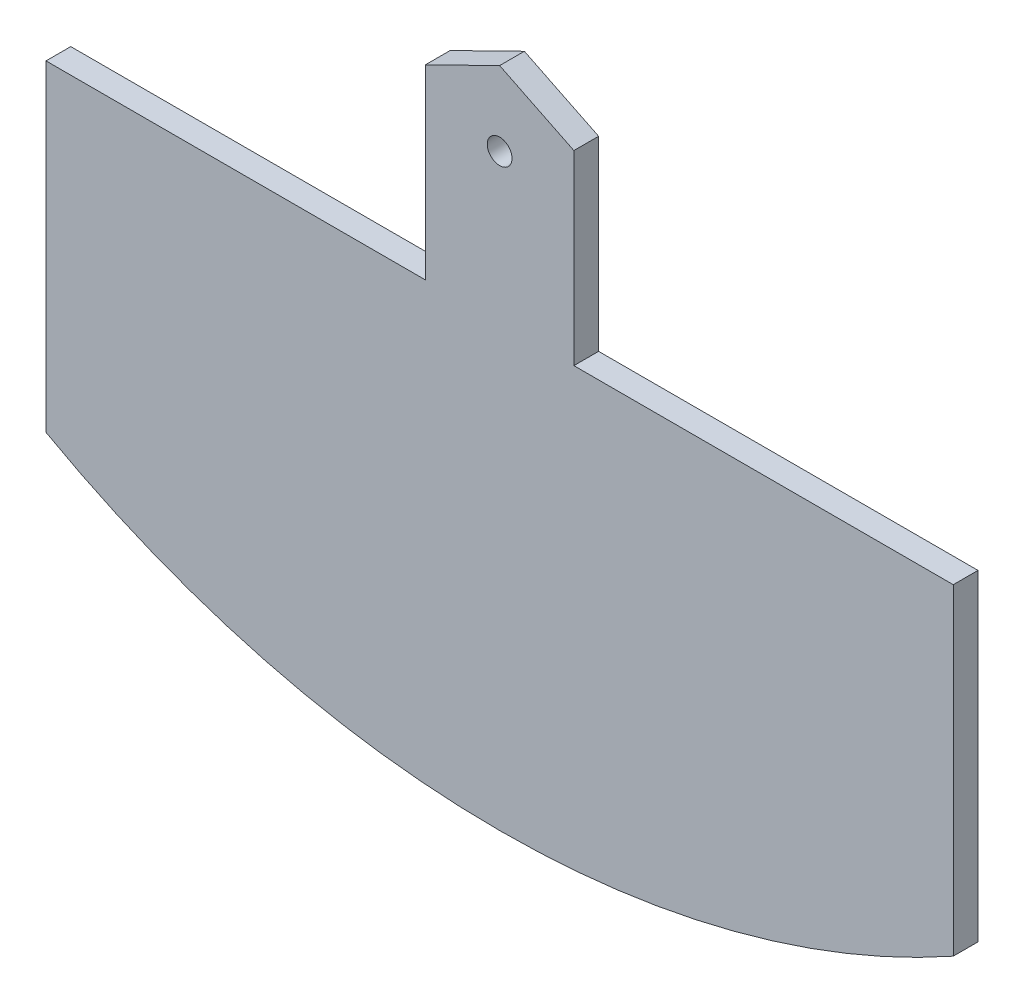
ISO-10303-21;
HEADER;
FILE_DESCRIPTION(('STEP AP214'),'2;1');
FILE_NAME('part.step','',(''),(''),'','','');
FILE_SCHEMA(('AUTOMOTIVE_DESIGN { 1 0 10303 214 1 1 1 1 }'));
ENDSEC;
DATA;
#1=APPLICATION_CONTEXT('core data for automotive mechanical design processes');
#2=APPLICATION_PROTOCOL_DEFINITION('international standard','automotive_design',2000,#1);
#3=PRODUCT_CONTEXT('',#1,'mechanical');
#4=PRODUCT('Part','Part','',(#3));
#5=PRODUCT_RELATED_PRODUCT_CATEGORY('part','',(#4));
#6=PRODUCT_DEFINITION_FORMATION('','',#4);
#7=PRODUCT_DEFINITION_CONTEXT('part definition',#1,'design');
#8=PRODUCT_DEFINITION('design','',#6,#7);
#9=PRODUCT_DEFINITION_SHAPE('','',#8);
#10=(LENGTH_UNIT() NAMED_UNIT(*) SI_UNIT(.MILLI.,.METRE.));
#11=(NAMED_UNIT(*) PLANE_ANGLE_UNIT() SI_UNIT($,.RADIAN.));
#12=(NAMED_UNIT(*) SI_UNIT($,.STERADIAN.) SOLID_ANGLE_UNIT());
#13=UNCERTAINTY_MEASURE_WITH_UNIT(LENGTH_MEASURE(1.E-05),#10,'distance_accuracy_value','');
#14=(GEOMETRIC_REPRESENTATION_CONTEXT(3) GLOBAL_UNCERTAINTY_ASSIGNED_CONTEXT((#13)) GLOBAL_UNIT_ASSIGNED_CONTEXT((#10,
#11,#12)) REPRESENTATION_CONTEXT('',''));
#15=CARTESIAN_POINT('',(0.,0.,0.));
#16=DIRECTION('',(0.,0.,1.));
#17=DIRECTION('',(1.,0.,0.));
#18=AXIS2_PLACEMENT_3D('',#15,#16,#17);
#19=CARTESIAN_POINT('',(-91.6460582894867,-30.,5.));
#20=DIRECTION('',(1.,0.,0.));
#21=DIRECTION('',(0.,0.,-1.));
#22=AXIS2_PLACEMENT_3D('',#19,#20,#21);
#23=PLANE('',#22);
#24=DIRECTION('',(0.,-1.,0.));
#25=VECTOR('',#24,1.);
#26=CARTESIAN_POINT('',(-91.6460582894867,-30.,0.));
#27=LINE('',#26,#25);
#28=CARTESIAN_POINT('',(-91.6460582894867,-30.,0.));
#29=VERTEX_POINT('',#28);
#30=CARTESIAN_POINT('',(-91.6460582894867,-95.,0.));
#31=VERTEX_POINT('',#30);
#32=EDGE_CURVE('E119',#29,#31,#27,.T.);
#33=ORIENTED_EDGE('',*,*,#32,.T.);
#34=DIRECTION('',(0.,0.,-1.));
#35=VECTOR('',#34,1.);
#36=CARTESIAN_POINT('',(-91.6460582894867,-95.,5.));
#37=LINE('',#36,#35);
#38=CARTESIAN_POINT('',(-91.6460582894867,-95.,5.));
#39=VERTEX_POINT('',#38);
#40=EDGE_CURVE('E11',#39,#31,#37,.T.);
#41=ORIENTED_EDGE('',*,*,#40,.F.);
#42=DIRECTION('',(0.,-1.,0.));
#43=VECTOR('',#42,1.);
#44=CARTESIAN_POINT('',(-91.6460582894867,-30.,5.));
#45=LINE('',#44,#43);
#46=CARTESIAN_POINT('',(-91.6460582894867,-30.,5.));
#47=VERTEX_POINT('',#46);
#48=EDGE_CURVE('E167',#47,#39,#45,.T.);
#49=ORIENTED_EDGE('',*,*,#48,.F.);
#50=DIRECTION('',(0.,0.,-1.));
#51=VECTOR('',#50,1.);
#52=CARTESIAN_POINT('',(-91.6460582894867,-30.,5.));
#53=LINE('',#52,#51);
#54=EDGE_CURVE('E176',#47,#29,#53,.T.);
#55=ORIENTED_EDGE('',*,*,#54,.T.);
#56=EDGE_LOOP('',(#33,#41,#49,#55));
#57=FACE_BOUND('',#56,.T.);
#58=ADVANCED_FACE('F39',(#57),#23,.F.);
#59=CARTESIAN_POINT('',(91.6460582894867,-30.,5.));
#60=DIRECTION('',(-1.,0.,0.));
#61=DIRECTION('',(0.,0.,1.));
#62=AXIS2_PLACEMENT_3D('',#59,#60,#61);
#63=PLANE('',#62);
#64=DIRECTION('',(0.,1.,0.));
#65=VECTOR('',#64,1.);
#66=CARTESIAN_POINT('',(91.6460582894867,-30.,0.));
#67=LINE('',#66,#65);
#68=CARTESIAN_POINT('',(91.6460582894867,-95.,0.));
#69=VERTEX_POINT('',#68);
#70=CARTESIAN_POINT('',(91.6460582894867,-30.,0.));
#71=VERTEX_POINT('',#70);
#72=EDGE_CURVE('E109',#69,#71,#67,.T.);
#73=ORIENTED_EDGE('',*,*,#72,.T.);
#74=DIRECTION('',(0.,0.,-1.));
#75=VECTOR('',#74,1.);
#76=CARTESIAN_POINT('',(91.6460582894867,-30.,5.));
#77=LINE('',#76,#75);
#78=CARTESIAN_POINT('',(91.6460582894867,-30.,5.));
#79=VERTEX_POINT('',#78);
#80=EDGE_CURVE('E128',#79,#71,#77,.T.);
#81=ORIENTED_EDGE('',*,*,#80,.F.);
#82=DIRECTION('',(0.,1.,0.));
#83=VECTOR('',#82,1.);
#84=CARTESIAN_POINT('',(91.6460582894867,-30.,5.));
#85=LINE('',#84,#83);
#86=CARTESIAN_POINT('',(91.6460582894867,-95.,5.));
#87=VERTEX_POINT('',#86);
#88=EDGE_CURVE('E124',#87,#79,#85,.T.);
#89=ORIENTED_EDGE('',*,*,#88,.F.);
#90=DIRECTION('',(0.,0.,-1.));
#91=VECTOR('',#90,1.);
#92=CARTESIAN_POINT('',(91.6460582894867,-95.,5.));
#93=LINE('',#92,#91);
#94=EDGE_CURVE('E46',#87,#69,#93,.T.);
#95=ORIENTED_EDGE('',*,*,#94,.T.);
#96=EDGE_LOOP('',(#73,#81,#89,#95));
#97=FACE_BOUND('',#96,.T.);
#98=ADVANCED_FACE('F122',(#97),#63,.F.);
#99=CARTESIAN_POINT('',(0.,15.,5.));
#100=DIRECTION('',(-0.44075303592825,-0.897628409376637,0.));
#101=DIRECTION('',(0.897628409376637,-0.44075303592825,0.));
#102=AXIS2_PLACEMENT_3D('',#99,#100,#101);
#103=PLANE('',#102);
#104=DIRECTION('',(-0.897628409376636,0.44075303592825,0.));
#105=VECTOR('',#104,1.);
#106=CARTESIAN_POINT('',(0.,15.,5.));
#107=LINE('',#106,#105);
#108=CARTESIAN_POINT('',(15.,7.63470778123544,5.));
#109=VERTEX_POINT('',#108);
#110=CARTESIAN_POINT('',(0.,15.,5.));
#111=VERTEX_POINT('',#110);
#112=EDGE_CURVE('E171',#109,#111,#107,.T.);
#113=ORIENTED_EDGE('',*,*,#112,.F.);
#114=DIRECTION('',(0.,0.,1.));
#115=VECTOR('',#114,1.);
#116=CARTESIAN_POINT('',(15.,7.63470778123544,0.));
#117=LINE('',#116,#115);
#118=CARTESIAN_POINT('',(15.,7.63470778123544,0.));
#119=VERTEX_POINT('',#118);
#120=EDGE_CURVE('E142',#119,#109,#117,.T.);
#121=ORIENTED_EDGE('',*,*,#120,.F.);
#122=DIRECTION('',(-0.897628409376636,0.44075303592825,0.));
#123=VECTOR('',#122,1.);
#124=CARTESIAN_POINT('',(0.,15.,0.));
#125=LINE('',#124,#123);
#126=CARTESIAN_POINT('',(0.,15.,0.));
#127=VERTEX_POINT('',#126);
#128=EDGE_CURVE('E118',#119,#127,#125,.T.);
#129=ORIENTED_EDGE('',*,*,#128,.T.);
#130=DIRECTION('',(0.,0.,-1.));
#131=VECTOR('',#130,1.);
#132=CARTESIAN_POINT('',(0.,15.,5.));
#133=LINE('',#132,#131);
#134=EDGE_CURVE('E183',#111,#127,#133,.T.);
#135=ORIENTED_EDGE('',*,*,#134,.F.);
#136=EDGE_LOOP('',(#113,#121,#129,#135));
#137=FACE_BOUND('',#136,.T.);
#138=ADVANCED_FACE('F207',(#137),#103,.F.);
#139=CARTESIAN_POINT('',(0.,15.,5.));
#140=DIRECTION('',(0.44075303592825,-0.897628409376637,0.));
#141=DIRECTION('',(0.897628409376637,0.44075303592825,0.));
#142=AXIS2_PLACEMENT_3D('',#139,#140,#141);
#143=PLANE('',#142);
#144=DIRECTION('',(-0.897628409376636,-0.44075303592825,0.));
#145=VECTOR('',#144,1.);
#146=CARTESIAN_POINT('',(0.,15.,0.));
#147=LINE('',#146,#145);
#148=CARTESIAN_POINT('',(-15.,7.63470778123544,0.));
#149=VERTEX_POINT('',#148);
#150=EDGE_CURVE('E169',#127,#149,#147,.T.);
#151=ORIENTED_EDGE('',*,*,#150,.T.);
#152=DIRECTION('',(0.,0.,1.));
#153=VECTOR('',#152,1.);
#154=CARTESIAN_POINT('',(-15.,7.63470778123544,0.));
#155=LINE('',#154,#153);
#156=CARTESIAN_POINT('',(-15.,7.63470778123544,5.));
#157=VERTEX_POINT('',#156);
#158=EDGE_CURVE('E134',#149,#157,#155,.T.);
#159=ORIENTED_EDGE('',*,*,#158,.T.);
#160=DIRECTION('',(-0.897628409376636,-0.44075303592825,0.));
#161=VECTOR('',#160,1.);
#162=CARTESIAN_POINT('',(0.,15.,5.));
#163=LINE('',#162,#161);
#164=EDGE_CURVE('E173',#111,#157,#163,.T.);
#165=ORIENTED_EDGE('',*,*,#164,.F.);
#166=ORIENTED_EDGE('',*,*,#134,.T.);
#167=EDGE_LOOP('',(#151,#159,#165,#166));
#168=FACE_BOUND('',#167,.T.);
#169=ADVANCED_FACE('F202',(#168),#143,.F.);
#170=CARTESIAN_POINT('',(0.,0.,5.));
#171=DIRECTION('',(0.,0.,1.));
#172=DIRECTION('',(1.,0.,0.));
#173=AXIS2_PLACEMENT_3D('',#170,#171,#172);
#174=PLANE('',#173);
#175=DIRECTION('',(1.,0.,0.));
#176=VECTOR('',#175,1.);
#177=CARTESIAN_POINT('',(91.6460582894867,-30.,5.));
#178=LINE('',#177,#176);
#179=CARTESIAN_POINT('',(15.,-30.,5.));
#180=VERTEX_POINT('',#179);
#181=EDGE_CURVE('E140',#180,#79,#178,.T.);
#182=ORIENTED_EDGE('',*,*,#181,.F.);
#183=DIRECTION('',(0.,-1.,0.));
#184=VECTOR('',#183,1.);
#185=CARTESIAN_POINT('',(15.,-30.,5.));
#186=LINE('',#185,#184);
#187=EDGE_CURVE('E143',#109,#180,#186,.T.);
#188=ORIENTED_EDGE('',*,*,#187,.F.);
#189=ORIENTED_EDGE('',*,*,#112,.T.);
#190=ORIENTED_EDGE('',*,*,#164,.T.);
#191=DIRECTION('',(0.,1.,0.));
#192=VECTOR('',#191,1.);
#193=CARTESIAN_POINT('',(-15.,-30.,5.));
#194=LINE('',#193,#192);
#195=CARTESIAN_POINT('',(-15.,-30.,5.));
#196=VERTEX_POINT('',#195);
#197=EDGE_CURVE('E146',#196,#157,#194,.T.);
#198=ORIENTED_EDGE('',*,*,#197,.F.);
#199=DIRECTION('',(1.,0.,0.));
#200=VECTOR('',#199,1.);
#201=CARTESIAN_POINT('',(-91.6460582894867,-30.,5.));
#202=LINE('',#201,#200);
#203=EDGE_CURVE('E155',#47,#196,#202,.T.);
#204=ORIENTED_EDGE('',*,*,#203,.F.);
#205=ORIENTED_EDGE('',*,*,#48,.T.);
#206=CARTESIAN_POINT('',(0.,69.1701379487097,5.));
#207=DIRECTION('',(0.,0.,1.));
#208=DIRECTION('',(1.,0.,0.));
#209=AXIS2_PLACEMENT_3D('',#206,#207,#208);
#210=CIRCLE('',#209,188.018175169579);
#211=EDGE_CURVE('E132',#39,#87,#210,.T.);
#212=ORIENTED_EDGE('',*,*,#211,.T.);
#213=ORIENTED_EDGE('',*,*,#88,.T.);
#214=EDGE_LOOP('',(#182,#188,#189,#190,#198,#204,#205,#212,#213));
#215=FACE_BOUND('',#214,.T.);
#216=CARTESIAN_POINT('',(0.,0.,5.));
#217=DIRECTION('',(0.,0.,1.));
#218=DIRECTION('',(1.,0.,0.));
#219=AXIS2_PLACEMENT_3D('',#216,#217,#218);
#220=CIRCLE('',#219,2.5);
#221=CARTESIAN_POINT('',(2.5,0.,5.));
#222=VERTEX_POINT('',#221);
#223=EDGE_CURVE('E150',#222,#222,#220,.T.);
#224=ORIENTED_EDGE('',*,*,#223,.F.);
#225=EDGE_LOOP('',(#224));
#226=FACE_BOUND('',#225,.T.);
#227=ADVANCED_FACE('F190',(#215,#226),#174,.T.);
#228=CARTESIAN_POINT('',(0.,0.,0.));
#229=DIRECTION('',(0.,0.,1.));
#230=DIRECTION('',(1.,0.,0.));
#231=AXIS2_PLACEMENT_3D('',#228,#229,#230);
#232=PLANE('',#231);
#233=CARTESIAN_POINT('',(0.,0.,0.));
#234=DIRECTION('',(0.,0.,1.));
#235=DIRECTION('',(1.,0.,0.));
#236=AXIS2_PLACEMENT_3D('',#233,#234,#235);
#237=CIRCLE('',#236,2.5);
#238=CARTESIAN_POINT('',(2.5,0.,0.));
#239=VERTEX_POINT('',#238);
#240=EDGE_CURVE('E162',#239,#239,#237,.T.);
#241=ORIENTED_EDGE('',*,*,#240,.T.);
#242=EDGE_LOOP('',(#241));
#243=FACE_BOUND('',#242,.T.);
#244=DIRECTION('',(0.,-1.,0.));
#245=VECTOR('',#244,1.);
#246=CARTESIAN_POINT('',(15.,-30.,0.));
#247=LINE('',#246,#245);
#248=CARTESIAN_POINT('',(15.,-30.,0.));
#249=VERTEX_POINT('',#248);
#250=EDGE_CURVE('E138',#119,#249,#247,.T.);
#251=ORIENTED_EDGE('',*,*,#250,.T.);
#252=DIRECTION('',(1.,0.,0.));
#253=VECTOR('',#252,1.);
#254=CARTESIAN_POINT('',(91.6460582894867,-30.,0.));
#255=LINE('',#254,#253);
#256=EDGE_CURVE('E53',#249,#71,#255,.T.);
#257=ORIENTED_EDGE('',*,*,#256,.T.);
#258=ORIENTED_EDGE('',*,*,#72,.F.);
#259=CARTESIAN_POINT('',(0.,69.1701379487097,0.));
#260=DIRECTION('',(0.,0.,1.));
#261=DIRECTION('',(1.,0.,0.));
#262=AXIS2_PLACEMENT_3D('',#259,#260,#261);
#263=CIRCLE('',#262,188.018175169579);
#264=EDGE_CURVE('E115',#31,#69,#263,.T.);
#265=ORIENTED_EDGE('',*,*,#264,.F.);
#266=ORIENTED_EDGE('',*,*,#32,.F.);
#267=DIRECTION('',(1.,0.,0.));
#268=VECTOR('',#267,1.);
#269=CARTESIAN_POINT('',(-91.6460582894867,-30.,0.));
#270=LINE('',#269,#268);
#271=CARTESIAN_POINT('',(-15.,-30.,0.));
#272=VERTEX_POINT('',#271);
#273=EDGE_CURVE('E153',#29,#272,#270,.T.);
#274=ORIENTED_EDGE('',*,*,#273,.T.);
#275=DIRECTION('',(0.,1.,0.));
#276=VECTOR('',#275,1.);
#277=CARTESIAN_POINT('',(-15.,-30.,0.));
#278=LINE('',#277,#276);
#279=EDGE_CURVE('E61',#272,#149,#278,.T.);
#280=ORIENTED_EDGE('',*,*,#279,.T.);
#281=ORIENTED_EDGE('',*,*,#150,.F.);
#282=ORIENTED_EDGE('',*,*,#128,.F.);
#283=EDGE_LOOP('',(#251,#257,#258,#265,#266,#274,#280,#281,#282));
#284=FACE_BOUND('',#283,.T.);
#285=ADVANCED_FACE('F112',(#243,#284),#232,.F.);
#286=CARTESIAN_POINT('',(0.,0.,0.));
#287=DIRECTION('',(0.,0.,1.));
#288=DIRECTION('',(1.,0.,0.));
#289=AXIS2_PLACEMENT_3D('',#286,#287,#288);
#290=CYLINDRICAL_SURFACE('',#289,2.5);
#291=ORIENTED_EDGE('',*,*,#240,.F.);
#292=EDGE_LOOP('',(#291));
#293=FACE_BOUND('',#292,.T.);
#294=ORIENTED_EDGE('',*,*,#223,.T.);
#295=EDGE_LOOP('',(#294));
#296=FACE_BOUND('',#295,.T.);
#297=ADVANCED_FACE('F234',(#293,#296),#290,.F.);
#298=CARTESIAN_POINT('',(-15.,-30.,0.));
#299=DIRECTION('',(1.,0.,0.));
#300=DIRECTION('',(0.,0.,-1.));
#301=AXIS2_PLACEMENT_3D('',#298,#299,#300);
#302=PLANE('',#301);
#303=ORIENTED_EDGE('',*,*,#197,.T.);
#304=ORIENTED_EDGE('',*,*,#158,.F.);
#305=ORIENTED_EDGE('',*,*,#279,.F.);
#306=DIRECTION('',(0.,0.,1.));
#307=VECTOR('',#306,1.);
#308=CARTESIAN_POINT('',(-15.,-30.,0.));
#309=LINE('',#308,#307);
#310=EDGE_CURVE('E131',#272,#196,#309,.T.);
#311=ORIENTED_EDGE('',*,*,#310,.T.);
#312=EDGE_LOOP('',(#303,#304,#305,#311));
#313=FACE_BOUND('',#312,.T.);
#314=ADVANCED_FACE('F199',(#313),#302,.F.);
#315=CARTESIAN_POINT('',(-91.6460582894867,-30.,0.));
#316=DIRECTION('',(0.,-1.,0.));
#317=DIRECTION('',(1.,0.,0.));
#318=AXIS2_PLACEMENT_3D('',#315,#316,#317);
#319=PLANE('',#318);
#320=ORIENTED_EDGE('',*,*,#203,.T.);
#321=ORIENTED_EDGE('',*,*,#310,.F.);
#322=ORIENTED_EDGE('',*,*,#273,.F.);
#323=ORIENTED_EDGE('',*,*,#54,.F.);
#324=EDGE_LOOP('',(#320,#321,#322,#323));
#325=FACE_BOUND('',#324,.T.);
#326=ADVANCED_FACE('F198',(#325),#319,.F.);
#327=CARTESIAN_POINT('',(91.6460582894867,-30.,0.));
#328=DIRECTION('',(0.,-1.,0.));
#329=DIRECTION('',(1.,0.,0.));
#330=AXIS2_PLACEMENT_3D('',#327,#328,#329);
#331=PLANE('',#330);
#332=ORIENTED_EDGE('',*,*,#181,.T.);
#333=ORIENTED_EDGE('',*,*,#80,.T.);
#334=ORIENTED_EDGE('',*,*,#256,.F.);
#335=DIRECTION('',(0.,0.,1.));
#336=VECTOR('',#335,1.);
#337=CARTESIAN_POINT('',(15.,-30.,0.));
#338=LINE('',#337,#336);
#339=EDGE_CURVE('E148',#249,#180,#338,.T.);
#340=ORIENTED_EDGE('',*,*,#339,.T.);
#341=EDGE_LOOP('',(#332,#333,#334,#340));
#342=FACE_BOUND('',#341,.T.);
#343=ADVANCED_FACE('F186',(#342),#331,.F.);
#344=CARTESIAN_POINT('',(15.,-30.,0.));
#345=DIRECTION('',(-1.,0.,0.));
#346=DIRECTION('',(0.,0.,1.));
#347=AXIS2_PLACEMENT_3D('',#344,#345,#346);
#348=PLANE('',#347);
#349=ORIENTED_EDGE('',*,*,#187,.T.);
#350=ORIENTED_EDGE('',*,*,#339,.F.);
#351=ORIENTED_EDGE('',*,*,#250,.F.);
#352=ORIENTED_EDGE('',*,*,#120,.T.);
#353=EDGE_LOOP('',(#349,#350,#351,#352));
#354=FACE_BOUND('',#353,.T.);
#355=ADVANCED_FACE('F210',(#354),#348,.F.);
#356=CARTESIAN_POINT('',(0.,69.1701379487097,0.));
#357=DIRECTION('',(0.,0.,1.));
#358=DIRECTION('',(1.,0.,0.));
#359=AXIS2_PLACEMENT_3D('',#356,#357,#358);
#360=CYLINDRICAL_SURFACE('',#359,188.018175169579);
#361=ORIENTED_EDGE('',*,*,#211,.F.);
#362=ORIENTED_EDGE('',*,*,#40,.T.);
#363=ORIENTED_EDGE('',*,*,#264,.T.);
#364=ORIENTED_EDGE('',*,*,#94,.F.);
#365=EDGE_LOOP('',(#361,#362,#363,#364));
#366=FACE_BOUND('',#365,.T.);
#367=ADVANCED_FACE('F129',(#366),#360,.T.);
#368=CLOSED_SHELL('',(#58,#98,#138,#169,#227,#285,#297,#314,#326,#343,#355,#367));
#369=MANIFOLD_SOLID_BREP('B2',#368);
#370=ADVANCED_BREP_SHAPE_REPRESENTATION('',(#18,#369),#14);
#371=SHAPE_DEFINITION_REPRESENTATION(#9,#370);
ENDSEC;
END-ISO-10303-21;
